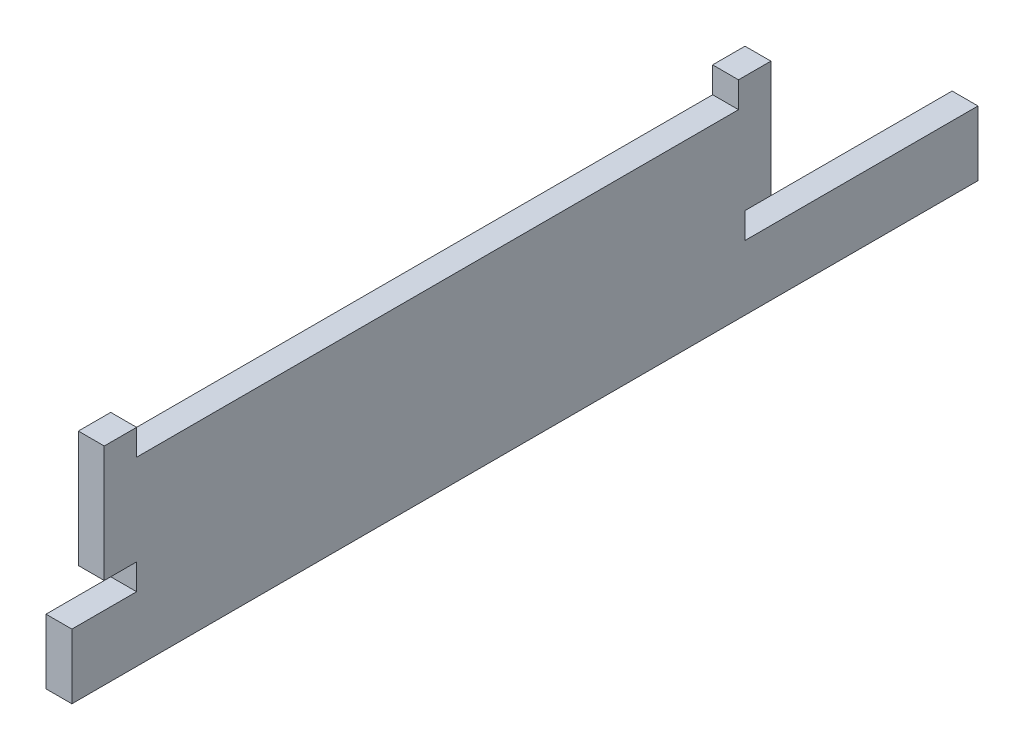
ISO-10303-21;
HEADER;
FILE_DESCRIPTION(('STEP AP214'),'2;1');
FILE_NAME('part.step','',(''),(''),'','','');
FILE_SCHEMA(('AUTOMOTIVE_DESIGN { 1 0 10303 214 1 1 1 1 }'));
ENDSEC;
DATA;
#1=APPLICATION_CONTEXT('core data for automotive mechanical design processes');
#2=APPLICATION_PROTOCOL_DEFINITION('international standard','automotive_design',2000,#1);
#3=PRODUCT_CONTEXT('',#1,'mechanical');
#4=PRODUCT('Part','Part','',(#3));
#5=PRODUCT_RELATED_PRODUCT_CATEGORY('part','',(#4));
#6=PRODUCT_DEFINITION_FORMATION('','',#4);
#7=PRODUCT_DEFINITION_CONTEXT('part definition',#1,'design');
#8=PRODUCT_DEFINITION('design','',#6,#7);
#9=PRODUCT_DEFINITION_SHAPE('','',#8);
#10=(LENGTH_UNIT() NAMED_UNIT(*) SI_UNIT(.MILLI.,.METRE.));
#11=(NAMED_UNIT(*) PLANE_ANGLE_UNIT() SI_UNIT($,.RADIAN.));
#12=(NAMED_UNIT(*) SI_UNIT($,.STERADIAN.) SOLID_ANGLE_UNIT());
#13=UNCERTAINTY_MEASURE_WITH_UNIT(LENGTH_MEASURE(1.E-05),#10,'distance_accuracy_value','');
#14=(GEOMETRIC_REPRESENTATION_CONTEXT(3) GLOBAL_UNCERTAINTY_ASSIGNED_CONTEXT((#13)) GLOBAL_UNIT_ASSIGNED_CONTEXT((#10,
#11,#12)) REPRESENTATION_CONTEXT('',''));
#15=CARTESIAN_POINT('',(0.,0.,0.));
#16=DIRECTION('',(0.,0.,1.));
#17=DIRECTION('',(1.,0.,0.));
#18=AXIS2_PLACEMENT_3D('',#15,#16,#17);
#19=CARTESIAN_POINT('',(4.,17.3983739837398,5.23577235772358));
#20=DIRECTION('',(0.,-1.,0.));
#21=DIRECTION('',(0.,0.,-1.));
#22=AXIS2_PLACEMENT_3D('',#19,#20,#21);
#23=PLANE('',#22);
#24=DIRECTION('',(0.,0.,1.));
#25=VECTOR('',#24,1.);
#26=CARTESIAN_POINT('',(0.,17.3983739837398,5.23577235772358));
#27=LINE('',#26,#25);
#28=CARTESIAN_POINT('',(0.,17.3983739837398,5.23577235772358));
#29=VERTEX_POINT('',#28);
#30=CARTESIAN_POINT('',(0.,17.3983739837398,10.2357723577236));
#31=VERTEX_POINT('',#30);
#32=EDGE_CURVE('E187',#29,#31,#27,.T.);
#33=ORIENTED_EDGE('',*,*,#32,.T.);
#34=DIRECTION('',(-1.,0.,0.));
#35=VECTOR('',#34,1.);
#36=CARTESIAN_POINT('',(4.,17.3983739837398,10.2357723577236));
#37=LINE('',#36,#35);
#38=CARTESIAN_POINT('',(4.,17.3983739837398,10.2357723577236));
#39=VERTEX_POINT('',#38);
#40=EDGE_CURVE('E11',#39,#31,#37,.T.);
#41=ORIENTED_EDGE('',*,*,#40,.F.);
#42=DIRECTION('',(0.,0.,1.));
#43=VECTOR('',#42,1.);
#44=CARTESIAN_POINT('',(4.,17.3983739837398,5.23577235772358));
#45=LINE('',#44,#43);
#46=CARTESIAN_POINT('',(4.,17.3983739837398,5.23577235772358));
#47=VERTEX_POINT('',#46);
#48=EDGE_CURVE('E233',#47,#39,#45,.T.);
#49=ORIENTED_EDGE('',*,*,#48,.F.);
#50=DIRECTION('',(-1.,0.,0.));
#51=VECTOR('',#50,1.);
#52=CARTESIAN_POINT('',(4.,17.3983739837398,5.23577235772358));
#53=LINE('',#52,#51);
#54=EDGE_CURVE('E183',#47,#29,#53,.T.);
#55=ORIENTED_EDGE('',*,*,#54,.T.);
#56=EDGE_LOOP('',(#33,#41,#49,#55));
#57=FACE_BOUND('',#56,.T.);
#58=ADVANCED_FACE('F38',(#57),#23,.F.);
#59=CARTESIAN_POINT('',(4.,17.3983739837398,10.2357723577236));
#60=DIRECTION('',(0.,0.,-1.));
#61=DIRECTION('',(0.,1.,0.));
#62=AXIS2_PLACEMENT_3D('',#59,#60,#61);
#63=PLANE('',#62);
#64=DIRECTION('',(0.,-1.,0.));
#65=VECTOR('',#64,1.);
#66=CARTESIAN_POINT('',(0.,17.3983739837398,10.2357723577236));
#67=LINE('',#66,#65);
#68=CARTESIAN_POINT('',(0.,-0.601626016260164,10.2357723577236));
#69=VERTEX_POINT('',#68);
#70=EDGE_CURVE('E191',#31,#69,#67,.T.);
#71=ORIENTED_EDGE('',*,*,#70,.T.);
#72=DIRECTION('',(-1.,0.,0.));
#73=VECTOR('',#72,1.);
#74=CARTESIAN_POINT('',(4.,-0.601626016260164,10.2357723577236));
#75=LINE('',#74,#73);
#76=CARTESIAN_POINT('',(4.,-0.601626016260164,10.2357723577236));
#77=VERTEX_POINT('',#76);
#78=EDGE_CURVE('E47',#77,#69,#75,.T.);
#79=ORIENTED_EDGE('',*,*,#78,.F.);
#80=DIRECTION('',(0.,-1.,0.));
#81=VECTOR('',#80,1.);
#82=CARTESIAN_POINT('',(4.,17.3983739837398,10.2357723577236));
#83=LINE('',#82,#81);
#84=EDGE_CURVE('E122',#39,#77,#83,.T.);
#85=ORIENTED_EDGE('',*,*,#84,.F.);
#86=ORIENTED_EDGE('',*,*,#40,.T.);
#87=EDGE_LOOP('',(#71,#79,#85,#86));
#88=FACE_BOUND('',#87,.T.);
#89=ADVANCED_FACE('F355',(#88),#63,.F.);
#90=CARTESIAN_POINT('',(4.,-0.601626016260164,10.2357723577236));
#91=DIRECTION('',(0.,1.,0.));
#92=DIRECTION('',(0.,0.,1.));
#93=AXIS2_PLACEMENT_3D('',#90,#91,#92);
#94=PLANE('',#93);
#95=DIRECTION('',(0.,0.,-1.));
#96=VECTOR('',#95,1.);
#97=CARTESIAN_POINT('',(0.,-0.601626016260164,10.2357723577236));
#98=LINE('',#97,#96);
#99=CARTESIAN_POINT('',(0.,-0.601626016260164,5.23577235772358));
#100=VERTEX_POINT('',#99);
#101=EDGE_CURVE('E194',#69,#100,#98,.T.);
#102=ORIENTED_EDGE('',*,*,#101,.T.);
#103=DIRECTION('',(-1.,0.,0.));
#104=VECTOR('',#103,1.);
#105=CARTESIAN_POINT('',(4.,-0.601626016260164,5.23577235772358));
#106=LINE('',#105,#104);
#107=CARTESIAN_POINT('',(4.,-0.601626016260164,5.23577235772358));
#108=VERTEX_POINT('',#107);
#109=EDGE_CURVE('E276',#108,#100,#106,.T.);
#110=ORIENTED_EDGE('',*,*,#109,.F.);
#111=DIRECTION('',(0.,0.,-1.));
#112=VECTOR('',#111,1.);
#113=CARTESIAN_POINT('',(4.,-0.601626016260164,10.2357723577236));
#114=LINE('',#113,#112);
#115=EDGE_CURVE('E286',#77,#108,#114,.T.);
#116=ORIENTED_EDGE('',*,*,#115,.F.);
#117=ORIENTED_EDGE('',*,*,#78,.T.);
#118=EDGE_LOOP('',(#102,#110,#116,#117));
#119=FACE_BOUND('',#118,.T.);
#120=ADVANCED_FACE('F284',(#119),#94,.F.);
#121=CARTESIAN_POINT('',(4.,-0.601626016260164,5.23577235772358));
#122=DIRECTION('',(0.,0.,-1.));
#123=DIRECTION('',(-1.,0.,0.));
#124=AXIS2_PLACEMENT_3D('',#121,#122,#123);
#125=PLANE('',#124);
#126=DIRECTION('',(0.,-1.,0.));
#127=VECTOR('',#126,1.);
#128=CARTESIAN_POINT('',(0.,-0.601626016260164,5.23577235772358));
#129=LINE('',#128,#127);
#130=CARTESIAN_POINT('',(0.,-4.60162601626016,5.23577235772358));
#131=VERTEX_POINT('',#130);
#132=EDGE_CURVE('E197',#100,#131,#129,.T.);
#133=ORIENTED_EDGE('',*,*,#132,.T.);
#134=DIRECTION('',(-1.,0.,0.));
#135=VECTOR('',#134,1.);
#136=CARTESIAN_POINT('',(4.,-4.60162601626016,5.23577235772358));
#137=LINE('',#136,#135);
#138=CARTESIAN_POINT('',(4.,-4.60162601626016,5.23577235772358));
#139=VERTEX_POINT('',#138);
#140=EDGE_CURVE('E272',#139,#131,#137,.T.);
#141=ORIENTED_EDGE('',*,*,#140,.F.);
#142=DIRECTION('',(0.,-1.,0.));
#143=VECTOR('',#142,1.);
#144=CARTESIAN_POINT('',(4.,-0.601626016260164,5.23577235772358));
#145=LINE('',#144,#143);
#146=EDGE_CURVE('E305',#108,#139,#145,.T.);
#147=ORIENTED_EDGE('',*,*,#146,.F.);
#148=ORIENTED_EDGE('',*,*,#109,.T.);
#149=EDGE_LOOP('',(#133,#141,#147,#148));
#150=FACE_BOUND('',#149,.T.);
#151=ADVANCED_FACE('F295',(#150),#125,.F.);
#152=CARTESIAN_POINT('',(4.,-4.60162601626016,5.23577235772358));
#153=DIRECTION('',(0.,-1.,0.));
#154=DIRECTION('',(0.,0.,-1.));
#155=AXIS2_PLACEMENT_3D('',#152,#153,#154);
#156=PLANE('',#155);
#157=DIRECTION('',(0.,0.,1.));
#158=VECTOR('',#157,1.);
#159=CARTESIAN_POINT('',(0.,-4.60162601626016,5.23577235772358));
#160=LINE('',#159,#158);
#161=CARTESIAN_POINT('',(0.,-4.60162601626016,15.2357723577236));
#162=VERTEX_POINT('',#161);
#163=EDGE_CURVE('E200',#131,#162,#160,.T.);
#164=ORIENTED_EDGE('',*,*,#163,.T.);
#165=DIRECTION('',(-1.,0.,0.));
#166=VECTOR('',#165,1.);
#167=CARTESIAN_POINT('',(4.,-4.60162601626016,15.2357723577236));
#168=LINE('',#167,#166);
#169=CARTESIAN_POINT('',(4.,-4.60162601626016,15.2357723577236));
#170=VERTEX_POINT('',#169);
#171=EDGE_CURVE('E268',#170,#162,#168,.T.);
#172=ORIENTED_EDGE('',*,*,#171,.F.);
#173=DIRECTION('',(0.,0.,1.));
#174=VECTOR('',#173,1.);
#175=CARTESIAN_POINT('',(4.,-4.60162601626016,5.23577235772358));
#176=LINE('',#175,#174);
#177=EDGE_CURVE('E301',#139,#170,#176,.T.);
#178=ORIENTED_EDGE('',*,*,#177,.F.);
#179=ORIENTED_EDGE('',*,*,#140,.T.);
#180=EDGE_LOOP('',(#164,#172,#178,#179));
#181=FACE_BOUND('',#180,.T.);
#182=ADVANCED_FACE('F299',(#181),#156,.F.);
#183=CARTESIAN_POINT('',(4.,-4.60162601626016,15.2357723577236));
#184=DIRECTION('',(0.,0.,-1.));
#185=DIRECTION('',(0.,1.,0.));
#186=AXIS2_PLACEMENT_3D('',#183,#184,#185);
#187=PLANE('',#186);
#188=DIRECTION('',(0.,-1.,0.));
#189=VECTOR('',#188,1.);
#190=CARTESIAN_POINT('',(0.,-4.60162601626016,15.2357723577236));
#191=LINE('',#190,#189);
#192=CARTESIAN_POINT('',(0.,-14.6016260162602,15.2357723577236));
#193=VERTEX_POINT('',#192);
#194=EDGE_CURVE('E203',#162,#193,#191,.T.);
#195=ORIENTED_EDGE('',*,*,#194,.T.);
#196=DIRECTION('',(-1.,0.,0.));
#197=VECTOR('',#196,1.);
#198=CARTESIAN_POINT('',(4.,-14.6016260162602,15.2357723577236));
#199=LINE('',#198,#197);
#200=CARTESIAN_POINT('',(4.,-14.6016260162602,15.2357723577236));
#201=VERTEX_POINT('',#200);
#202=EDGE_CURVE('E264',#201,#193,#199,.T.);
#203=ORIENTED_EDGE('',*,*,#202,.F.);
#204=DIRECTION('',(0.,-1.,0.));
#205=VECTOR('',#204,1.);
#206=CARTESIAN_POINT('',(4.,-4.60162601626016,15.2357723577236));
#207=LINE('',#206,#205);
#208=EDGE_CURVE('E304',#170,#201,#207,.T.);
#209=ORIENTED_EDGE('',*,*,#208,.F.);
#210=ORIENTED_EDGE('',*,*,#171,.T.);
#211=EDGE_LOOP('',(#195,#203,#209,#210));
#212=FACE_BOUND('',#211,.T.);
#213=ADVANCED_FACE('F368',(#212),#187,.F.);
#214=CARTESIAN_POINT('',(4.,-14.6016260162602,15.2357723577236));
#215=DIRECTION('',(0.,1.,0.));
#216=DIRECTION('',(0.,0.,1.));
#217=AXIS2_PLACEMENT_3D('',#214,#215,#216);
#218=PLANE('',#217);
#219=DIRECTION('',(0.,0.,-1.));
#220=VECTOR('',#219,1.);
#221=CARTESIAN_POINT('',(0.,-14.6016260162602,15.2357723577236));
#222=LINE('',#221,#220);
#223=CARTESIAN_POINT('',(0.,-14.6016260162602,-124.764227642276));
#224=VERTEX_POINT('',#223);
#225=EDGE_CURVE('E206',#193,#224,#222,.T.);
#226=ORIENTED_EDGE('',*,*,#225,.T.);
#227=DIRECTION('',(-1.,0.,0.));
#228=VECTOR('',#227,1.);
#229=CARTESIAN_POINT('',(4.,-14.6016260162602,-124.764227642276));
#230=LINE('',#229,#228);
#231=CARTESIAN_POINT('',(4.,-14.6016260162602,-124.764227642276));
#232=VERTEX_POINT('',#231);
#233=EDGE_CURVE('E260',#232,#224,#230,.T.);
#234=ORIENTED_EDGE('',*,*,#233,.F.);
#235=DIRECTION('',(0.,0.,-1.));
#236=VECTOR('',#235,1.);
#237=CARTESIAN_POINT('',(4.,-14.6016260162602,15.2357723577236));
#238=LINE('',#237,#236);
#239=EDGE_CURVE('E309',#201,#232,#238,.T.);
#240=ORIENTED_EDGE('',*,*,#239,.F.);
#241=ORIENTED_EDGE('',*,*,#202,.T.);
#242=EDGE_LOOP('',(#226,#234,#240,#241));
#243=FACE_BOUND('',#242,.T.);
#244=ADVANCED_FACE('F371',(#243),#218,.F.);
#245=CARTESIAN_POINT('',(4.,-4.60162601626017,-124.764227642276));
#246=DIRECTION('',(0.,0.,1.));
#247=DIRECTION('',(1.,0.,0.));
#248=AXIS2_PLACEMENT_3D('',#245,#246,#247);
#249=PLANE('',#248);
#250=DIRECTION('',(0.,1.,0.));
#251=VECTOR('',#250,1.);
#252=CARTESIAN_POINT('',(0.,-4.60162601626017,-124.764227642276));
#253=LINE('',#252,#251);
#254=CARTESIAN_POINT('',(0.,-4.60162601626017,-124.764227642276));
#255=VERTEX_POINT('',#254);
#256=EDGE_CURVE('E209',#224,#255,#253,.T.);
#257=ORIENTED_EDGE('',*,*,#256,.T.);
#258=DIRECTION('',(-1.,0.,0.));
#259=VECTOR('',#258,1.);
#260=CARTESIAN_POINT('',(4.,-4.60162601626017,-124.764227642276));
#261=LINE('',#260,#259);
#262=CARTESIAN_POINT('',(4.,-4.60162601626017,-124.764227642276));
#263=VERTEX_POINT('',#262);
#264=EDGE_CURVE('E256',#263,#255,#261,.T.);
#265=ORIENTED_EDGE('',*,*,#264,.F.);
#266=DIRECTION('',(0.,1.,0.));
#267=VECTOR('',#266,1.);
#268=CARTESIAN_POINT('',(4.,-4.60162601626017,-124.764227642276));
#269=LINE('',#268,#267);
#270=EDGE_CURVE('E316',#232,#263,#269,.T.);
#271=ORIENTED_EDGE('',*,*,#270,.F.);
#272=ORIENTED_EDGE('',*,*,#233,.T.);
#273=EDGE_LOOP('',(#257,#265,#271,#272));
#274=FACE_BOUND('',#273,.T.);
#275=ADVANCED_FACE('F375',(#274),#249,.F.);
#276=CARTESIAN_POINT('',(4.,-4.60162601626017,-88.7642276422764));
#277=DIRECTION('',(0.,-1.,0.));
#278=DIRECTION('',(0.,0.,-1.));
#279=AXIS2_PLACEMENT_3D('',#276,#277,#278);
#280=PLANE('',#279);
#281=DIRECTION('',(0.,0.,1.));
#282=VECTOR('',#281,1.);
#283=CARTESIAN_POINT('',(0.,-4.60162601626017,-88.7642276422764));
#284=LINE('',#283,#282);
#285=CARTESIAN_POINT('',(0.,-4.60162601626017,-88.7642276422764));
#286=VERTEX_POINT('',#285);
#287=EDGE_CURVE('E212',#255,#286,#284,.T.);
#288=ORIENTED_EDGE('',*,*,#287,.T.);
#289=DIRECTION('',(-1.,0.,0.));
#290=VECTOR('',#289,1.);
#291=CARTESIAN_POINT('',(4.,-4.60162601626017,-88.7642276422764));
#292=LINE('',#291,#290);
#293=CARTESIAN_POINT('',(4.,-4.60162601626017,-88.7642276422764));
#294=VERTEX_POINT('',#293);
#295=EDGE_CURVE('E252',#294,#286,#292,.T.);
#296=ORIENTED_EDGE('',*,*,#295,.F.);
#297=DIRECTION('',(0.,0.,1.));
#298=VECTOR('',#297,1.);
#299=CARTESIAN_POINT('',(4.,-4.60162601626017,-88.7642276422764));
#300=LINE('',#299,#298);
#301=EDGE_CURVE('E319',#263,#294,#300,.T.);
#302=ORIENTED_EDGE('',*,*,#301,.F.);
#303=ORIENTED_EDGE('',*,*,#264,.T.);
#304=EDGE_LOOP('',(#288,#296,#302,#303));
#305=FACE_BOUND('',#304,.T.);
#306=ADVANCED_FACE('F379',(#305),#280,.F.);
#307=CARTESIAN_POINT('',(4.,-0.601626016260164,-88.7642276422764));
#308=DIRECTION('',(0.,0.,1.));
#309=DIRECTION('',(1.,0.,0.));
#310=AXIS2_PLACEMENT_3D('',#307,#308,#309);
#311=PLANE('',#310);
#312=DIRECTION('',(0.,1.,0.));
#313=VECTOR('',#312,1.);
#314=CARTESIAN_POINT('',(0.,-0.601626016260164,-88.7642276422764));
#315=LINE('',#314,#313);
#316=CARTESIAN_POINT('',(0.,-0.601626016260164,-88.7642276422764));
#317=VERTEX_POINT('',#316);
#318=EDGE_CURVE('E215',#286,#317,#315,.T.);
#319=ORIENTED_EDGE('',*,*,#318,.T.);
#320=DIRECTION('',(-1.,0.,0.));
#321=VECTOR('',#320,1.);
#322=CARTESIAN_POINT('',(4.,-0.601626016260164,-88.7642276422764));
#323=LINE('',#322,#321);
#324=CARTESIAN_POINT('',(4.,-0.601626016260164,-88.7642276422764));
#325=VERTEX_POINT('',#324);
#326=EDGE_CURVE('E248',#325,#317,#323,.T.);
#327=ORIENTED_EDGE('',*,*,#326,.F.);
#328=DIRECTION('',(0.,1.,0.));
#329=VECTOR('',#328,1.);
#330=CARTESIAN_POINT('',(4.,-0.601626016260164,-88.7642276422764));
#331=LINE('',#330,#329);
#332=EDGE_CURVE('E322',#294,#325,#331,.T.);
#333=ORIENTED_EDGE('',*,*,#332,.F.);
#334=ORIENTED_EDGE('',*,*,#295,.T.);
#335=EDGE_LOOP('',(#319,#327,#333,#334));
#336=FACE_BOUND('',#335,.T.);
#337=ADVANCED_FACE('F383',(#336),#311,.F.);
#338=CARTESIAN_POINT('',(4.,-0.601626016260164,-92.7642276422764));
#339=DIRECTION('',(0.,1.,0.));
#340=DIRECTION('',(0.,0.,1.));
#341=AXIS2_PLACEMENT_3D('',#338,#339,#340);
#342=PLANE('',#341);
#343=DIRECTION('',(0.,0.,-1.));
#344=VECTOR('',#343,1.);
#345=CARTESIAN_POINT('',(0.,-0.601626016260164,-92.7642276422764));
#346=LINE('',#345,#344);
#347=CARTESIAN_POINT('',(0.,-0.601626016260164,-92.7642276422764));
#348=VERTEX_POINT('',#347);
#349=EDGE_CURVE('E218',#317,#348,#346,.T.);
#350=ORIENTED_EDGE('',*,*,#349,.T.);
#351=DIRECTION('',(-1.,0.,0.));
#352=VECTOR('',#351,1.);
#353=CARTESIAN_POINT('',(4.,-0.601626016260164,-92.7642276422764));
#354=LINE('',#353,#352);
#355=CARTESIAN_POINT('',(4.,-0.601626016260164,-92.7642276422764));
#356=VERTEX_POINT('',#355);
#357=EDGE_CURVE('E244',#356,#348,#354,.T.);
#358=ORIENTED_EDGE('',*,*,#357,.F.);
#359=DIRECTION('',(0.,0.,-1.));
#360=VECTOR('',#359,1.);
#361=CARTESIAN_POINT('',(4.,-0.601626016260164,-92.7642276422764));
#362=LINE('',#361,#360);
#363=EDGE_CURVE('E325',#325,#356,#362,.T.);
#364=ORIENTED_EDGE('',*,*,#363,.F.);
#365=ORIENTED_EDGE('',*,*,#326,.T.);
#366=EDGE_LOOP('',(#350,#358,#364,#365));
#367=FACE_BOUND('',#366,.T.);
#368=ADVANCED_FACE('F387',(#367),#342,.F.);
#369=CARTESIAN_POINT('',(4.,17.3983739837398,-92.7642276422764));
#370=DIRECTION('',(0.,0.,1.));
#371=DIRECTION('',(1.,0.,0.));
#372=AXIS2_PLACEMENT_3D('',#369,#370,#371);
#373=PLANE('',#372);
#374=DIRECTION('',(0.,1.,0.));
#375=VECTOR('',#374,1.);
#376=CARTESIAN_POINT('',(0.,17.3983739837398,-92.7642276422764));
#377=LINE('',#376,#375);
#378=CARTESIAN_POINT('',(0.,17.3983739837398,-92.7642276422764));
#379=VERTEX_POINT('',#378);
#380=EDGE_CURVE('E221',#348,#379,#377,.T.);
#381=ORIENTED_EDGE('',*,*,#380,.T.);
#382=DIRECTION('',(-1.,0.,0.));
#383=VECTOR('',#382,1.);
#384=CARTESIAN_POINT('',(4.,17.3983739837398,-92.7642276422764));
#385=LINE('',#384,#383);
#386=CARTESIAN_POINT('',(4.,17.3983739837398,-92.7642276422764));
#387=VERTEX_POINT('',#386);
#388=EDGE_CURVE('E240',#387,#379,#385,.T.);
#389=ORIENTED_EDGE('',*,*,#388,.F.);
#390=DIRECTION('',(0.,1.,0.));
#391=VECTOR('',#390,1.);
#392=CARTESIAN_POINT('',(4.,17.3983739837398,-92.7642276422764));
#393=LINE('',#392,#391);
#394=EDGE_CURVE('E328',#356,#387,#393,.T.);
#395=ORIENTED_EDGE('',*,*,#394,.F.);
#396=ORIENTED_EDGE('',*,*,#357,.T.);
#397=EDGE_LOOP('',(#381,#389,#395,#396));
#398=FACE_BOUND('',#397,.T.);
#399=ADVANCED_FACE('F336',(#398),#373,.F.);
#400=CARTESIAN_POINT('',(4.,17.3983739837398,-87.7642276422764));
#401=DIRECTION('',(0.,-1.,0.));
#402=DIRECTION('',(0.,0.,-1.));
#403=AXIS2_PLACEMENT_3D('',#400,#401,#402);
#404=PLANE('',#403);
#405=DIRECTION('',(0.,0.,1.));
#406=VECTOR('',#405,1.);
#407=CARTESIAN_POINT('',(0.,17.3983739837398,-87.7642276422764));
#408=LINE('',#407,#406);
#409=CARTESIAN_POINT('',(0.,17.3983739837398,-87.7642276422764));
#410=VERTEX_POINT('',#409);
#411=EDGE_CURVE('E224',#379,#410,#408,.T.);
#412=ORIENTED_EDGE('',*,*,#411,.T.);
#413=DIRECTION('',(-1.,0.,0.));
#414=VECTOR('',#413,1.);
#415=CARTESIAN_POINT('',(4.,17.3983739837398,-87.7642276422764));
#416=LINE('',#415,#414);
#417=CARTESIAN_POINT('',(4.,17.3983739837398,-87.7642276422764));
#418=VERTEX_POINT('',#417);
#419=EDGE_CURVE('E176',#418,#410,#416,.T.);
#420=ORIENTED_EDGE('',*,*,#419,.F.);
#421=DIRECTION('',(0.,0.,1.));
#422=VECTOR('',#421,1.);
#423=CARTESIAN_POINT('',(4.,17.3983739837398,-87.7642276422764));
#424=LINE('',#423,#422);
#425=EDGE_CURVE('E165',#387,#418,#424,.T.);
#426=ORIENTED_EDGE('',*,*,#425,.F.);
#427=ORIENTED_EDGE('',*,*,#388,.T.);
#428=EDGE_LOOP('',(#412,#420,#426,#427));
#429=FACE_BOUND('',#428,.T.);
#430=ADVANCED_FACE('F340',(#429),#404,.F.);
#431=CARTESIAN_POINT('',(4.,13.3983739837398,-87.7642276422764));
#432=DIRECTION('',(0.,0.,-1.));
#433=DIRECTION('',(-1.,0.,0.));
#434=AXIS2_PLACEMENT_3D('',#431,#432,#433);
#435=PLANE('',#434);
#436=DIRECTION('',(0.,-1.,0.));
#437=VECTOR('',#436,1.);
#438=CARTESIAN_POINT('',(0.,13.3983739837398,-87.7642276422764));
#439=LINE('',#438,#437);
#440=CARTESIAN_POINT('',(0.,13.3983739837398,-87.7642276422764));
#441=VERTEX_POINT('',#440);
#442=EDGE_CURVE('E174',#410,#441,#439,.T.);
#443=ORIENTED_EDGE('',*,*,#442,.T.);
#444=DIRECTION('',(-1.,0.,0.));
#445=VECTOR('',#444,1.);
#446=CARTESIAN_POINT('',(4.,13.3983739837398,-87.7642276422764));
#447=LINE('',#446,#445);
#448=CARTESIAN_POINT('',(4.,13.3983739837398,-87.7642276422764));
#449=VERTEX_POINT('',#448);
#450=EDGE_CURVE('E171',#449,#441,#447,.T.);
#451=ORIENTED_EDGE('',*,*,#450,.F.);
#452=DIRECTION('',(0.,-1.,0.));
#453=VECTOR('',#452,1.);
#454=CARTESIAN_POINT('',(4.,13.3983739837398,-87.7642276422764));
#455=LINE('',#454,#453);
#456=EDGE_CURVE('E159',#418,#449,#455,.T.);
#457=ORIENTED_EDGE('',*,*,#456,.F.);
#458=ORIENTED_EDGE('',*,*,#419,.T.);
#459=EDGE_LOOP('',(#443,#451,#457,#458));
#460=FACE_BOUND('',#459,.T.);
#461=ADVANCED_FACE('F172',(#460),#435,.F.);
#462=CARTESIAN_POINT('',(4.,13.3983739837398,-87.7642276422764));
#463=DIRECTION('',(0.,-1.,0.));
#464=DIRECTION('',(0.,0.,-1.));
#465=AXIS2_PLACEMENT_3D('',#462,#463,#464);
#466=PLANE('',#465);
#467=DIRECTION('',(0.,0.,1.));
#468=VECTOR('',#467,1.);
#469=CARTESIAN_POINT('',(0.,13.3983739837398,-87.7642276422764));
#470=LINE('',#469,#468);
#471=CARTESIAN_POINT('',(0.,13.3983739837398,5.23577235772358));
#472=VERTEX_POINT('',#471);
#473=EDGE_CURVE('E108',#441,#472,#470,.T.);
#474=ORIENTED_EDGE('',*,*,#473,.T.);
#475=DIRECTION('',(-1.,0.,0.));
#476=VECTOR('',#475,1.);
#477=CARTESIAN_POINT('',(4.,13.3983739837398,5.23577235772358));
#478=LINE('',#477,#476);
#479=CARTESIAN_POINT('',(4.,13.3983739837398,5.23577235772358));
#480=VERTEX_POINT('',#479);
#481=EDGE_CURVE('E177',#480,#472,#478,.T.);
#482=ORIENTED_EDGE('',*,*,#481,.F.);
#483=DIRECTION('',(0.,0.,1.));
#484=VECTOR('',#483,1.);
#485=CARTESIAN_POINT('',(4.,13.3983739837398,-87.7642276422764));
#486=LINE('',#485,#484);
#487=EDGE_CURVE('E163',#449,#480,#486,.T.);
#488=ORIENTED_EDGE('',*,*,#487,.F.);
#489=ORIENTED_EDGE('',*,*,#450,.T.);
#490=EDGE_LOOP('',(#474,#482,#488,#489));
#491=FACE_BOUND('',#490,.T.);
#492=ADVANCED_FACE('F179',(#491),#466,.F.);
#493=CARTESIAN_POINT('',(4.,13.3983739837398,5.23577235772358));
#494=DIRECTION('',(0.,0.,1.));
#495=DIRECTION('',(1.,0.,0.));
#496=AXIS2_PLACEMENT_3D('',#493,#494,#495);
#497=PLANE('',#496);
#498=DIRECTION('',(0.,1.,0.));
#499=VECTOR('',#498,1.);
#500=CARTESIAN_POINT('',(0.,13.3983739837398,5.23577235772358));
#501=LINE('',#500,#499);
#502=EDGE_CURVE('E114',#472,#29,#501,.T.);
#503=ORIENTED_EDGE('',*,*,#502,.T.);
#504=ORIENTED_EDGE('',*,*,#54,.F.);
#505=DIRECTION('',(0.,1.,0.));
#506=VECTOR('',#505,1.);
#507=CARTESIAN_POINT('',(4.,13.3983739837398,5.23577235772358));
#508=LINE('',#507,#506);
#509=EDGE_CURVE('E55',#480,#47,#508,.T.);
#510=ORIENTED_EDGE('',*,*,#509,.F.);
#511=ORIENTED_EDGE('',*,*,#481,.T.);
#512=EDGE_LOOP('',(#503,#504,#510,#511));
#513=FACE_BOUND('',#512,.T.);
#514=ADVANCED_FACE('F344',(#513),#497,.F.);
#515=CARTESIAN_POINT('',(4.,0.,0.));
#516=DIRECTION('',(1.,0.,0.));
#517=DIRECTION('',(0.,0.,-1.));
#518=AXIS2_PLACEMENT_3D('',#515,#516,#517);
#519=PLANE('',#518);
#520=ORIENTED_EDGE('',*,*,#48,.T.);
#521=ORIENTED_EDGE('',*,*,#84,.T.);
#522=ORIENTED_EDGE('',*,*,#115,.T.);
#523=ORIENTED_EDGE('',*,*,#146,.T.);
#524=ORIENTED_EDGE('',*,*,#177,.T.);
#525=ORIENTED_EDGE('',*,*,#208,.T.);
#526=ORIENTED_EDGE('',*,*,#239,.T.);
#527=ORIENTED_EDGE('',*,*,#270,.T.);
#528=ORIENTED_EDGE('',*,*,#301,.T.);
#529=ORIENTED_EDGE('',*,*,#332,.T.);
#530=ORIENTED_EDGE('',*,*,#363,.T.);
#531=ORIENTED_EDGE('',*,*,#394,.T.);
#532=ORIENTED_EDGE('',*,*,#425,.T.);
#533=ORIENTED_EDGE('',*,*,#456,.T.);
#534=ORIENTED_EDGE('',*,*,#487,.T.);
#535=ORIENTED_EDGE('',*,*,#509,.T.);
#536=EDGE_LOOP('',(#520,#521,#522,#523,#524,#525,#526,#527,#528,#529,#530,#531,#532,#533,#534,#535));
#537=FACE_BOUND('',#536,.T.);
#538=ADVANCED_FACE('F161',(#537),#519,.T.);
#539=CARTESIAN_POINT('',(0.,0.,0.));
#540=DIRECTION('',(1.,0.,0.));
#541=DIRECTION('',(0.,0.,-1.));
#542=AXIS2_PLACEMENT_3D('',#539,#540,#541);
#543=PLANE('',#542);
#544=ORIENTED_EDGE('',*,*,#32,.F.);
#545=ORIENTED_EDGE('',*,*,#502,.F.);
#546=ORIENTED_EDGE('',*,*,#473,.F.);
#547=ORIENTED_EDGE('',*,*,#442,.F.);
#548=ORIENTED_EDGE('',*,*,#411,.F.);
#549=ORIENTED_EDGE('',*,*,#380,.F.);
#550=ORIENTED_EDGE('',*,*,#349,.F.);
#551=ORIENTED_EDGE('',*,*,#318,.F.);
#552=ORIENTED_EDGE('',*,*,#287,.F.);
#553=ORIENTED_EDGE('',*,*,#256,.F.);
#554=ORIENTED_EDGE('',*,*,#225,.F.);
#555=ORIENTED_EDGE('',*,*,#194,.F.);
#556=ORIENTED_EDGE('',*,*,#163,.F.);
#557=ORIENTED_EDGE('',*,*,#132,.F.);
#558=ORIENTED_EDGE('',*,*,#101,.F.);
#559=ORIENTED_EDGE('',*,*,#70,.F.);
#560=EDGE_LOOP('',(#544,#545,#546,#547,#548,#549,#550,#551,#552,#553,#554,#555,#556,#557,#558,#559));
#561=FACE_BOUND('',#560,.T.);
#562=ADVANCED_FACE('F290',(#561),#543,.F.);
#563=CLOSED_SHELL('',(#58,#89,#120,#151,#182,#213,#244,#275,#306,#337,#368,#399,#430,#461,#492,
#514,#538,#562));
#564=MANIFOLD_SOLID_BREP('B2',#563);
#565=ADVANCED_BREP_SHAPE_REPRESENTATION('',(#18,#564),#14);
#566=SHAPE_DEFINITION_REPRESENTATION(#9,#565);
ENDSEC;
END-ISO-10303-21;
